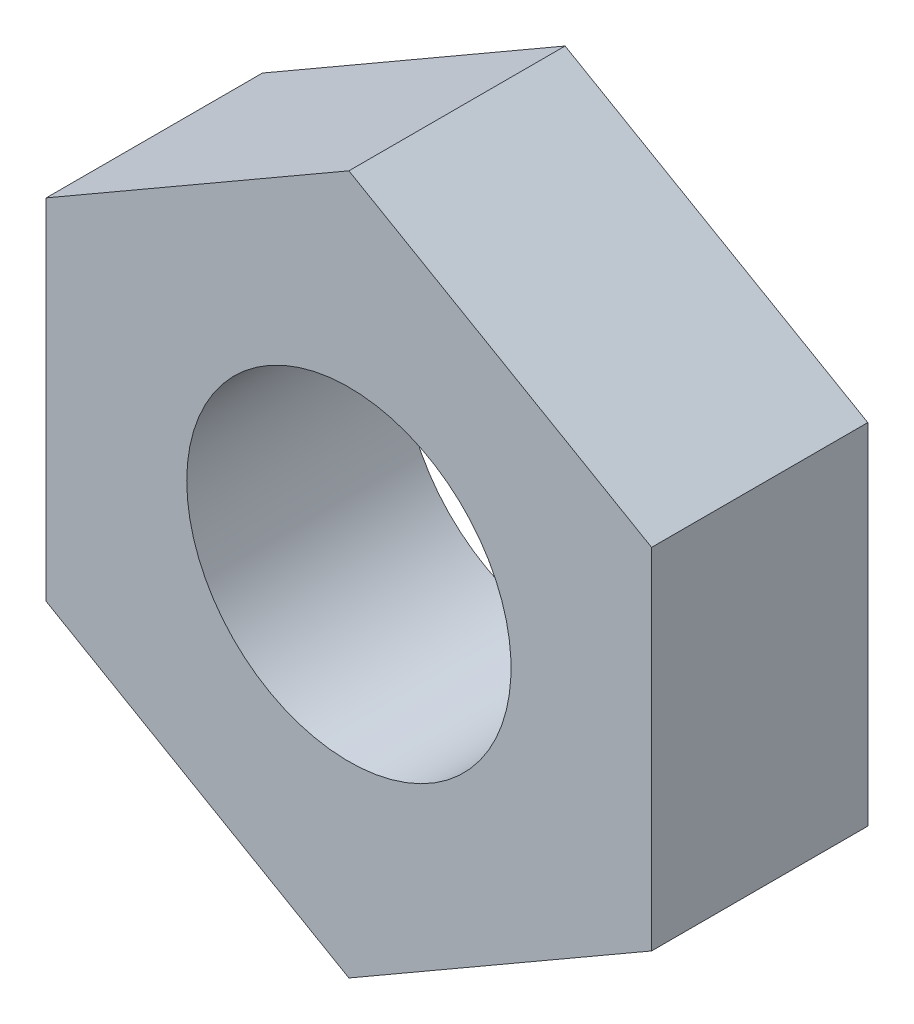
ISO-10303-21;
HEADER;
FILE_DESCRIPTION(('STEP AP214'),'2;1');
FILE_NAME('part.step','',(''),(''),'','','');
FILE_SCHEMA(('AUTOMOTIVE_DESIGN { 1 0 10303 214 1 1 1 1 }'));
ENDSEC;
DATA;
#1=APPLICATION_CONTEXT('core data for automotive mechanical design processes');
#2=APPLICATION_PROTOCOL_DEFINITION('international standard','automotive_design',2000,#1);
#3=PRODUCT_CONTEXT('',#1,'mechanical');
#4=PRODUCT('Part','Part','',(#3));
#5=PRODUCT_RELATED_PRODUCT_CATEGORY('part','',(#4));
#6=PRODUCT_DEFINITION_FORMATION('','',#4);
#7=PRODUCT_DEFINITION_CONTEXT('part definition',#1,'design');
#8=PRODUCT_DEFINITION('design','',#6,#7);
#9=PRODUCT_DEFINITION_SHAPE('','',#8);
#10=(LENGTH_UNIT() NAMED_UNIT(*) SI_UNIT(.MILLI.,.METRE.));
#11=(NAMED_UNIT(*) PLANE_ANGLE_UNIT() SI_UNIT($,.RADIAN.));
#12=(NAMED_UNIT(*) SI_UNIT($,.STERADIAN.) SOLID_ANGLE_UNIT());
#13=UNCERTAINTY_MEASURE_WITH_UNIT(LENGTH_MEASURE(1.E-05),#10,'distance_accuracy_value','');
#14=(GEOMETRIC_REPRESENTATION_CONTEXT(3) GLOBAL_UNCERTAINTY_ASSIGNED_CONTEXT((#13)) GLOBAL_UNIT_ASSIGNED_CONTEXT((#10,
#11,#12)) REPRESENTATION_CONTEXT('',''));
#15=CARTESIAN_POINT('',(0.,0.,0.));
#16=DIRECTION('',(0.,0.,1.));
#17=DIRECTION('',(1.,0.,0.));
#18=AXIS2_PLACEMENT_3D('',#15,#16,#17);
#19=CARTESIAN_POINT('',(0.,0.,0.));
#20=DIRECTION('',(0.,0.,-1.));
#21=DIRECTION('',(0.,-1.,0.));
#22=AXIS2_PLACEMENT_3D('',#19,#20,#21);
#23=PLANE('',#22);
#24=CARTESIAN_POINT('',(0.,0.,0.));
#25=DIRECTION('',(0.,0.,1.));
#26=DIRECTION('',(1.,0.,0.));
#27=AXIS2_PLACEMENT_3D('',#24,#25,#26);
#28=CIRCLE('',#27,1.5);
#29=CARTESIAN_POINT('',(-1.5,0.,0.));
#30=VERTEX_POINT('',#29);
#31=EDGE_CURVE('E153',#30,#30,#28,.T.);
#32=ORIENTED_EDGE('',*,*,#31,.F.);
#33=EDGE_LOOP('',(#32));
#34=FACE_BOUND('',#33,.T.);
#35=DIRECTION('',(0.,-1.,0.));
#36=VECTOR('',#35,1.);
#37=CARTESIAN_POINT('',(2.8,1.61658075373095,0.));
#38=LINE('',#37,#36);
#39=CARTESIAN_POINT('',(2.8,1.61658075373095,0.));
#40=VERTEX_POINT('',#39);
#41=CARTESIAN_POINT('',(2.8,-1.61658075373095,0.));
#42=VERTEX_POINT('',#41);
#43=EDGE_CURVE('E30',#40,#42,#38,.T.);
#44=ORIENTED_EDGE('',*,*,#43,.F.);
#45=DIRECTION('',(0.866025403784439,-0.5,0.));
#46=VECTOR('',#45,1.);
#47=CARTESIAN_POINT('',(0.,3.2331615074619,0.));
#48=LINE('',#47,#46);
#49=CARTESIAN_POINT('',(0.,3.2331615074619,0.));
#50=VERTEX_POINT('',#49);
#51=EDGE_CURVE('E110',#50,#40,#48,.T.);
#52=ORIENTED_EDGE('',*,*,#51,.F.);
#53=DIRECTION('',(0.866025403784439,0.5,0.));
#54=VECTOR('',#53,1.);
#55=CARTESIAN_POINT('',(-2.8,1.61658075373095,0.));
#56=LINE('',#55,#54);
#57=CARTESIAN_POINT('',(-2.8,1.61658075373095,0.));
#58=VERTEX_POINT('',#57);
#59=EDGE_CURVE('E106',#58,#50,#56,.T.);
#60=ORIENTED_EDGE('',*,*,#59,.F.);
#61=DIRECTION('',(0.,1.,0.));
#62=VECTOR('',#61,1.);
#63=CARTESIAN_POINT('',(-2.8,-1.61658075373095,0.));
#64=LINE('',#63,#62);
#65=CARTESIAN_POINT('',(-2.8,-1.61658075373095,0.));
#66=VERTEX_POINT('',#65);
#67=EDGE_CURVE('E124',#66,#58,#64,.T.);
#68=ORIENTED_EDGE('',*,*,#67,.F.);
#69=DIRECTION('',(-0.866025403784439,0.5,0.));
#70=VECTOR('',#69,1.);
#71=CARTESIAN_POINT('',(0.,-3.2331615074619,0.));
#72=LINE('',#71,#70);
#73=CARTESIAN_POINT('',(0.,-3.2331615074619,0.));
#74=VERTEX_POINT('',#73);
#75=EDGE_CURVE('E93',#74,#66,#72,.T.);
#76=ORIENTED_EDGE('',*,*,#75,.F.);
#77=DIRECTION('',(-0.866025403784439,-0.5,0.));
#78=VECTOR('',#77,1.);
#79=CARTESIAN_POINT('',(2.8,-1.61658075373095,0.));
#80=LINE('',#79,#78);
#81=EDGE_CURVE('E80',#42,#74,#80,.T.);
#82=ORIENTED_EDGE('',*,*,#81,.F.);
#83=EDGE_LOOP('',(#44,#52,#60,#68,#76,#82));
#84=FACE_BOUND('',#83,.T.);
#85=ADVANCED_FACE('F17',(#34,#84),#23,.F.);
#86=CARTESIAN_POINT('',(0.,0.,-2.));
#87=DIRECTION('',(0.,0.,-1.));
#88=DIRECTION('',(0.,-1.,0.));
#89=AXIS2_PLACEMENT_3D('',#86,#87,#88);
#90=PLANE('',#89);
#91=CARTESIAN_POINT('',(0.,0.,-2.));
#92=DIRECTION('',(0.,0.,1.));
#93=DIRECTION('',(1.,0.,0.));
#94=AXIS2_PLACEMENT_3D('',#91,#92,#93);
#95=CIRCLE('',#94,1.5);
#96=CARTESIAN_POINT('',(-1.5,0.,-2.));
#97=VERTEX_POINT('',#96);
#98=EDGE_CURVE('E99',#97,#97,#95,.T.);
#99=ORIENTED_EDGE('',*,*,#98,.T.);
#100=EDGE_LOOP('',(#99));
#101=FACE_BOUND('',#100,.T.);
#102=DIRECTION('',(0.,-1.,0.));
#103=VECTOR('',#102,1.);
#104=CARTESIAN_POINT('',(2.8,1.61658075373095,-2.));
#105=LINE('',#104,#103);
#106=CARTESIAN_POINT('',(2.8,1.61658075373095,-2.));
#107=VERTEX_POINT('',#106);
#108=CARTESIAN_POINT('',(2.8,-1.61658075373095,-2.));
#109=VERTEX_POINT('',#108);
#110=EDGE_CURVE('E11',#107,#109,#105,.T.);
#111=ORIENTED_EDGE('',*,*,#110,.T.);
#112=DIRECTION('',(-0.866025403784439,-0.5,0.));
#113=VECTOR('',#112,1.);
#114=CARTESIAN_POINT('',(2.8,-1.61658075373095,-2.));
#115=LINE('',#114,#113);
#116=CARTESIAN_POINT('',(0.,-3.2331615074619,-2.));
#117=VERTEX_POINT('',#116);
#118=EDGE_CURVE('E70',#109,#117,#115,.T.);
#119=ORIENTED_EDGE('',*,*,#118,.T.);
#120=DIRECTION('',(-0.866025403784439,0.5,0.));
#121=VECTOR('',#120,1.);
#122=CARTESIAN_POINT('',(0.,-3.2331615074619,-2.));
#123=LINE('',#122,#121);
#124=CARTESIAN_POINT('',(-2.8,-1.61658075373095,-2.));
#125=VERTEX_POINT('',#124);
#126=EDGE_CURVE('E75',#117,#125,#123,.T.);
#127=ORIENTED_EDGE('',*,*,#126,.T.);
#128=DIRECTION('',(0.,1.,0.));
#129=VECTOR('',#128,1.);
#130=CARTESIAN_POINT('',(-2.8,-1.61658075373095,-2.));
#131=LINE('',#130,#129);
#132=CARTESIAN_POINT('',(-2.8,1.61658075373095,-2.));
#133=VERTEX_POINT('',#132);
#134=EDGE_CURVE('E128',#125,#133,#131,.T.);
#135=ORIENTED_EDGE('',*,*,#134,.T.);
#136=DIRECTION('',(0.866025403784439,0.5,0.));
#137=VECTOR('',#136,1.);
#138=CARTESIAN_POINT('',(-2.8,1.61658075373095,-2.));
#139=LINE('',#138,#137);
#140=CARTESIAN_POINT('',(0.,3.2331615074619,-2.));
#141=VERTEX_POINT('',#140);
#142=EDGE_CURVE('E105',#133,#141,#139,.T.);
#143=ORIENTED_EDGE('',*,*,#142,.T.);
#144=DIRECTION('',(0.866025403784439,-0.5,0.));
#145=VECTOR('',#144,1.);
#146=CARTESIAN_POINT('',(0.,3.2331615074619,-2.));
#147=LINE('',#146,#145);
#148=EDGE_CURVE('E113',#141,#107,#147,.T.);
#149=ORIENTED_EDGE('',*,*,#148,.T.);
#150=EDGE_LOOP('',(#111,#119,#127,#135,#143,#149));
#151=FACE_BOUND('',#150,.T.);
#152=ADVANCED_FACE('F67',(#101,#151),#90,.T.);
#153=CARTESIAN_POINT('',(2.8,1.61658075373095,0.));
#154=DIRECTION('',(1.,0.,0.));
#155=DIRECTION('',(0.,1.,0.));
#156=AXIS2_PLACEMENT_3D('',#153,#154,#155);
#157=PLANE('',#156);
#158=ORIENTED_EDGE('',*,*,#43,.T.);
#159=DIRECTION('',(0.,0.,-1.));
#160=VECTOR('',#159,1.);
#161=CARTESIAN_POINT('',(2.8,-1.61658075373095,0.));
#162=LINE('',#161,#160);
#163=EDGE_CURVE('E76',#42,#109,#162,.T.);
#164=ORIENTED_EDGE('',*,*,#163,.T.);
#165=ORIENTED_EDGE('',*,*,#110,.F.);
#166=DIRECTION('',(0.,0.,-1.));
#167=VECTOR('',#166,1.);
#168=CARTESIAN_POINT('',(2.8,1.61658075373095,0.));
#169=LINE('',#168,#167);
#170=EDGE_CURVE('E112',#40,#107,#169,.T.);
#171=ORIENTED_EDGE('',*,*,#170,.F.);
#172=EDGE_LOOP('',(#158,#164,#165,#171));
#173=FACE_BOUND('',#172,.T.);
#174=ADVANCED_FACE('F137',(#173),#157,.T.);
#175=CARTESIAN_POINT('',(2.8,-1.61658075373095,0.));
#176=DIRECTION('',(0.5,-0.866025403784439,0.));
#177=DIRECTION('',(0.,0.,-1.));
#178=AXIS2_PLACEMENT_3D('',#175,#176,#177);
#179=PLANE('',#178);
#180=ORIENTED_EDGE('',*,*,#81,.T.);
#181=DIRECTION('',(0.,0.,-1.));
#182=VECTOR('',#181,1.);
#183=CARTESIAN_POINT('',(0.,-3.2331615074619,0.));
#184=LINE('',#183,#182);
#185=EDGE_CURVE('E79',#74,#117,#184,.T.);
#186=ORIENTED_EDGE('',*,*,#185,.T.);
#187=ORIENTED_EDGE('',*,*,#118,.F.);
#188=ORIENTED_EDGE('',*,*,#163,.F.);
#189=EDGE_LOOP('',(#180,#186,#187,#188));
#190=FACE_BOUND('',#189,.T.);
#191=ADVANCED_FACE('F19',(#190),#179,.T.);
#192=CARTESIAN_POINT('',(0.,-3.2331615074619,0.));
#193=DIRECTION('',(-0.5,-0.866025403784439,0.));
#194=DIRECTION('',(-0.866025403784439,0.5,0.));
#195=AXIS2_PLACEMENT_3D('',#192,#193,#194);
#196=PLANE('',#195);
#197=ORIENTED_EDGE('',*,*,#75,.T.);
#198=DIRECTION('',(0.,0.,-1.));
#199=VECTOR('',#198,1.);
#200=CARTESIAN_POINT('',(-2.8,-1.61658075373095,0.));
#201=LINE('',#200,#199);
#202=EDGE_CURVE('E86',#66,#125,#201,.T.);
#203=ORIENTED_EDGE('',*,*,#202,.T.);
#204=ORIENTED_EDGE('',*,*,#126,.F.);
#205=ORIENTED_EDGE('',*,*,#185,.F.);
#206=EDGE_LOOP('',(#197,#203,#204,#205));
#207=FACE_BOUND('',#206,.T.);
#208=ADVANCED_FACE('F88',(#207),#196,.T.);
#209=CARTESIAN_POINT('',(-2.8,-1.61658075373095,0.));
#210=DIRECTION('',(-1.,0.,0.));
#211=DIRECTION('',(0.,1.,0.));
#212=AXIS2_PLACEMENT_3D('',#209,#210,#211);
#213=PLANE('',#212);
#214=ORIENTED_EDGE('',*,*,#67,.T.);
#215=DIRECTION('',(0.,0.,-1.));
#216=VECTOR('',#215,1.);
#217=CARTESIAN_POINT('',(-2.8,1.61658075373095,0.));
#218=LINE('',#217,#216);
#219=EDGE_CURVE('E104',#58,#133,#218,.T.);
#220=ORIENTED_EDGE('',*,*,#219,.T.);
#221=ORIENTED_EDGE('',*,*,#134,.F.);
#222=ORIENTED_EDGE('',*,*,#202,.F.);
#223=EDGE_LOOP('',(#214,#220,#221,#222));
#224=FACE_BOUND('',#223,.T.);
#225=ADVANCED_FACE('F148',(#224),#213,.T.);
#226=CARTESIAN_POINT('',(-2.8,1.61658075373095,0.));
#227=DIRECTION('',(-0.5,0.866025403784439,0.));
#228=DIRECTION('',(0.,0.,1.));
#229=AXIS2_PLACEMENT_3D('',#226,#227,#228);
#230=PLANE('',#229);
#231=ORIENTED_EDGE('',*,*,#59,.T.);
#232=DIRECTION('',(0.,0.,-1.));
#233=VECTOR('',#232,1.);
#234=CARTESIAN_POINT('',(0.,3.2331615074619,0.));
#235=LINE('',#234,#233);
#236=EDGE_CURVE('E119',#50,#141,#235,.T.);
#237=ORIENTED_EDGE('',*,*,#236,.T.);
#238=ORIENTED_EDGE('',*,*,#142,.F.);
#239=ORIENTED_EDGE('',*,*,#219,.F.);
#240=EDGE_LOOP('',(#231,#237,#238,#239));
#241=FACE_BOUND('',#240,.T.);
#242=ADVANCED_FACE('F165',(#241),#230,.T.);
#243=CARTESIAN_POINT('',(0.,3.2331615074619,0.));
#244=DIRECTION('',(0.5,0.866025403784439,0.));
#245=DIRECTION('',(0.,0.,-1.));
#246=AXIS2_PLACEMENT_3D('',#243,#244,#245);
#247=PLANE('',#246);
#248=ORIENTED_EDGE('',*,*,#51,.T.);
#249=ORIENTED_EDGE('',*,*,#170,.T.);
#250=ORIENTED_EDGE('',*,*,#148,.F.);
#251=ORIENTED_EDGE('',*,*,#236,.F.);
#252=EDGE_LOOP('',(#248,#249,#250,#251));
#253=FACE_BOUND('',#252,.T.);
#254=ADVANCED_FACE('F167',(#253),#247,.T.);
#255=CARTESIAN_POINT('',(0.,0.,0.));
#256=DIRECTION('',(0.,0.,-1.));
#257=DIRECTION('',(1.,0.,0.));
#258=AXIS2_PLACEMENT_3D('',#255,#256,#257);
#259=CYLINDRICAL_SURFACE('',#258,1.5);
#260=ORIENTED_EDGE('',*,*,#98,.F.);
#261=EDGE_LOOP('',(#260));
#262=FACE_BOUND('',#261,.T.);
#263=ORIENTED_EDGE('',*,*,#31,.T.);
#264=EDGE_LOOP('',(#263));
#265=FACE_BOUND('',#264,.T.);
#266=ADVANCED_FACE('F182',(#262,#265),#259,.F.);
#267=CLOSED_SHELL('',(#85,#152,#174,#191,#208,#225,#242,#254,#266));
#268=MANIFOLD_SOLID_BREP('B1',#267);
#269=ADVANCED_BREP_SHAPE_REPRESENTATION('',(#18,#268),#14);
#270=SHAPE_DEFINITION_REPRESENTATION(#9,#269);
ENDSEC;
END-ISO-10303-21;
